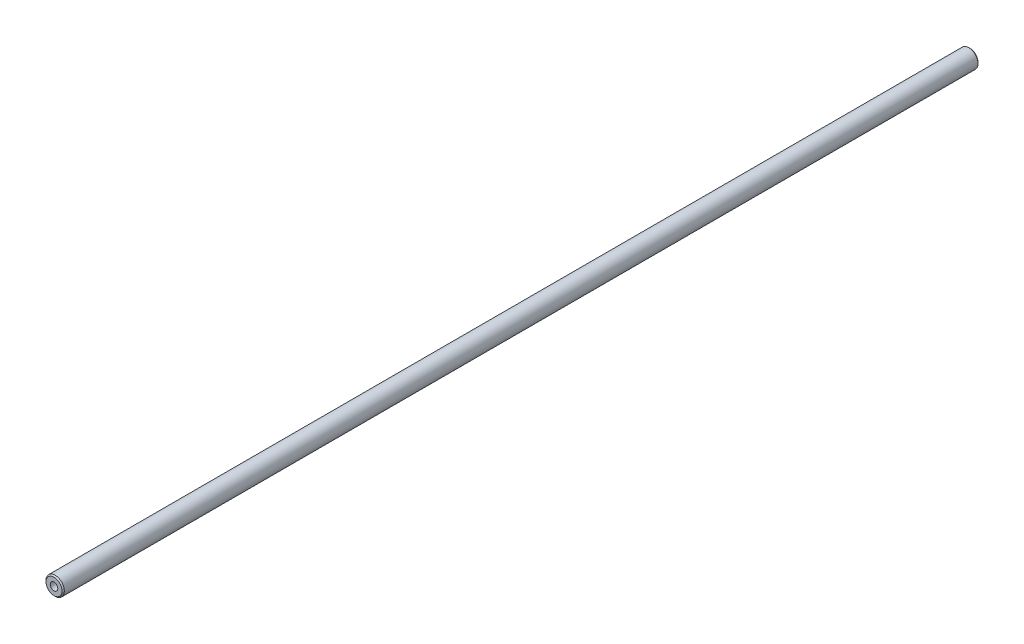
ISO-10303-21;
HEADER;
FILE_DESCRIPTION(('STEP AP214'),'2;1');
FILE_NAME('part.step','',(''),(''),'','','');
FILE_SCHEMA(('AUTOMOTIVE_DESIGN { 1 0 10303 214 1 1 1 1 }'));
ENDSEC;
DATA;
#1=APPLICATION_CONTEXT('core data for automotive mechanical design processes');
#2=APPLICATION_PROTOCOL_DEFINITION('international standard','automotive_design',2000,#1);
#3=PRODUCT_CONTEXT('',#1,'mechanical');
#4=PRODUCT('Part','Part','',(#3));
#5=PRODUCT_RELATED_PRODUCT_CATEGORY('part','',(#4));
#6=PRODUCT_DEFINITION_FORMATION('','',#4);
#7=PRODUCT_DEFINITION_CONTEXT('part definition',#1,'design');
#8=PRODUCT_DEFINITION('design','',#6,#7);
#9=PRODUCT_DEFINITION_SHAPE('','',#8);
#10=(LENGTH_UNIT() NAMED_UNIT(*) SI_UNIT(.MILLI.,.METRE.));
#11=(NAMED_UNIT(*) PLANE_ANGLE_UNIT() SI_UNIT($,.RADIAN.));
#12=(NAMED_UNIT(*) SI_UNIT($,.STERADIAN.) SOLID_ANGLE_UNIT());
#13=UNCERTAINTY_MEASURE_WITH_UNIT(LENGTH_MEASURE(1.E-05),#10,'distance_accuracy_value','');
#14=(GEOMETRIC_REPRESENTATION_CONTEXT(3) GLOBAL_UNCERTAINTY_ASSIGNED_CONTEXT((#13)) GLOBAL_UNIT_ASSIGNED_CONTEXT((#10,
#11,#12)) REPRESENTATION_CONTEXT('',''));
#15=CARTESIAN_POINT('',(0.,0.,0.));
#16=DIRECTION('',(0.,0.,1.));
#17=DIRECTION('',(1.,0.,0.));
#18=AXIS2_PLACEMENT_3D('',#15,#16,#17);
#19=CARTESIAN_POINT('',(0.,0.,388.499999999908));
#20=DIRECTION('',(0.,0.,1.));
#21=DIRECTION('',(0.,-1.,0.));
#22=AXIS2_PLACEMENT_3D('',#19,#20,#21);
#23=CONICAL_SURFACE('',#22,1.64999999981319,1.02974425851388);
#24=CARTESIAN_POINT('',(-1.98951966012828E-10,0.,387.508579978487));
#25=VERTEX_POINT('',#24);
#26=VERTEX_LOOP('',#25);
#27=FACE_BOUND('',#26,.T.);
#28=CARTESIAN_POINT('',(0.,0.,388.5));
#29=DIRECTION('',(0.,0.,1.));
#30=DIRECTION('',(1.,0.,0.));
#31=AXIS2_PLACEMENT_3D('',#28,#29,#30);
#32=CIRCLE('',#31,1.64999999999999);
#33=CARTESIAN_POINT('',(1.64999999999999,0.,388.5));
#34=VERTEX_POINT('',#33);
#35=EDGE_CURVE('E37',#34,#34,#32,.T.);
#36=ORIENTED_EDGE('',*,*,#35,.T.);
#37=EDGE_LOOP('',(#36));
#38=FACE_BOUND('',#37,.T.);
#39=ADVANCED_FACE('F17',(#27,#38),#23,.F.);
#40=CARTESIAN_POINT('',(0.,0.,11.5000000000123));
#41=DIRECTION('',(0.,0.,-1.));
#42=DIRECTION('',(-1.,0.,0.));
#43=AXIS2_PLACEMENT_3D('',#40,#41,#42);
#44=CONICAL_SURFACE('',#43,1.65000000004056,1.02974425860513);
#45=CARTESIAN_POINT('',(0.,-5.68426539819307E-11,12.4914200214619));
#46=VERTEX_POINT('',#45);
#47=VERTEX_LOOP('',#46);
#48=FACE_BOUND('',#47,.T.);
#49=CARTESIAN_POINT('',(0.,0.,11.5));
#50=DIRECTION('',(0.,0.,-1.));
#51=DIRECTION('',(0.,1.,0.));
#52=AXIS2_PLACEMENT_3D('',#49,#50,#51);
#53=CIRCLE('',#52,1.64999999999999);
#54=CARTESIAN_POINT('',(0.,1.64999999999999,11.5));
#55=VERTEX_POINT('',#54);
#56=EDGE_CURVE('E39',#55,#55,#53,.T.);
#57=ORIENTED_EDGE('',*,*,#56,.T.);
#58=EDGE_LOOP('',(#57));
#59=FACE_BOUND('',#58,.T.);
#60=ADVANCED_FACE('F34',(#48,#59),#44,.F.);
#61=CARTESIAN_POINT('',(0.,0.,400.));
#62=DIRECTION('',(0.,0.,1.));
#63=DIRECTION('',(1.,0.,0.));
#64=AXIS2_PLACEMENT_3D('',#61,#62,#63);
#65=CYLINDRICAL_SURFACE('',#64,1.64999999999999);
#66=CARTESIAN_POINT('',(0.,0.,400.));
#67=DIRECTION('',(0.,0.,1.));
#68=DIRECTION('',(1.,0.,0.));
#69=AXIS2_PLACEMENT_3D('',#66,#67,#68);
#70=CIRCLE('',#69,1.64999999999999);
#71=CARTESIAN_POINT('',(1.64999999999999,0.,400.));
#72=VERTEX_POINT('',#71);
#73=EDGE_CURVE('E20',#72,#72,#70,.F.);
#74=ORIENTED_EDGE('',*,*,#73,.F.);
#75=EDGE_LOOP('',(#74));
#76=FACE_BOUND('',#75,.T.);
#77=ORIENTED_EDGE('',*,*,#35,.F.);
#78=EDGE_LOOP('',(#77));
#79=FACE_BOUND('',#78,.T.);
#80=ADVANCED_FACE('F59',(#76,#79),#65,.F.);
#81=CARTESIAN_POINT('',(0.,0.,0.));
#82=DIRECTION('',(0.,0.,-1.));
#83=DIRECTION('',(0.,1.,0.));
#84=AXIS2_PLACEMENT_3D('',#81,#82,#83);
#85=CYLINDRICAL_SURFACE('',#84,1.64999999999999);
#86=ORIENTED_EDGE('',*,*,#56,.F.);
#87=EDGE_LOOP('',(#86));
#88=FACE_BOUND('',#87,.T.);
#89=CARTESIAN_POINT('',(0.,0.,0.));
#90=DIRECTION('',(0.,0.,-1.));
#91=DIRECTION('',(0.,1.,0.));
#92=AXIS2_PLACEMENT_3D('',#89,#90,#91);
#93=CIRCLE('',#92,1.64999999999999);
#94=CARTESIAN_POINT('',(0.,1.64999999999999,0.));
#95=VERTEX_POINT('',#94);
#96=EDGE_CURVE('E50',#95,#95,#93,.T.);
#97=ORIENTED_EDGE('',*,*,#96,.T.);
#98=EDGE_LOOP('',(#97));
#99=FACE_BOUND('',#98,.T.);
#100=ADVANCED_FACE('F61',(#88,#99),#85,.F.);
#101=CARTESIAN_POINT('',(0.,0.,400.));
#102=DIRECTION('',(0.,0.,1.));
#103=DIRECTION('',(1.,0.,0.));
#104=AXIS2_PLACEMENT_3D('',#101,#102,#103);
#105=PLANE('',#104);
#106=CARTESIAN_POINT('',(0.,0.,399.99999999992));
#107=DIRECTION('',(0.,0.,-1.));
#108=DIRECTION('',(-1.,0.,0.));
#109=AXIS2_PLACEMENT_3D('',#106,#107,#108);
#110=CIRCLE('',#109,3.49999999997408);
#111=CARTESIAN_POINT('',(-3.49999999997408,0.,399.99999999992));
#112=VERTEX_POINT('',#111);
#113=EDGE_CURVE('E48',#112,#112,#110,.T.);
#114=ORIENTED_EDGE('',*,*,#113,.F.);
#115=EDGE_LOOP('',(#114));
#116=FACE_BOUND('',#115,.T.);
#117=ORIENTED_EDGE('',*,*,#73,.T.);
#118=EDGE_LOOP('',(#117));
#119=FACE_BOUND('',#118,.T.);
#120=ADVANCED_FACE('F57',(#116,#119),#105,.T.);
#121=CARTESIAN_POINT('',(0.,0.,0.));
#122=DIRECTION('',(0.,0.,1.));
#123=DIRECTION('',(1.,0.,0.));
#124=AXIS2_PLACEMENT_3D('',#121,#122,#123);
#125=PLANE('',#124);
#126=CARTESIAN_POINT('',(0.,0.,0.));
#127=DIRECTION('',(0.,0.,1.));
#128=DIRECTION('',(1.,0.,0.));
#129=AXIS2_PLACEMENT_3D('',#126,#127,#128);
#130=CIRCLE('',#129,3.49999999997408);
#131=CARTESIAN_POINT('',(3.49999999997408,0.,0.));
#132=VERTEX_POINT('',#131);
#133=EDGE_CURVE('E45',#132,#132,#130,.T.);
#134=ORIENTED_EDGE('',*,*,#133,.F.);
#135=EDGE_LOOP('',(#134));
#136=FACE_BOUND('',#135,.T.);
#137=ORIENTED_EDGE('',*,*,#96,.F.);
#138=EDGE_LOOP('',(#137));
#139=FACE_BOUND('',#138,.T.);
#140=ADVANCED_FACE('F85',(#136,#139),#125,.F.);
#141=CARTESIAN_POINT('',(0.,0.,399.499999999989));
#142=DIRECTION('',(0.,0.,-1.));
#143=DIRECTION('',(-1.,0.,0.));
#144=AXIS2_PLACEMENT_3D('',#141,#142,#143);
#145=CONICAL_SURFACE('',#144,3.99999999990541,0.785398163397448);
#146=CARTESIAN_POINT('',(0.,0.,399.5));
#147=DIRECTION('',(0.,0.,-1.));
#148=DIRECTION('',(-1.,0.,0.));
#149=AXIS2_PLACEMENT_3D('',#146,#147,#148);
#150=CIRCLE('',#149,4.);
#151=CARTESIAN_POINT('',(-4.,0.,399.5));
#152=VERTEX_POINT('',#151);
#153=EDGE_CURVE('E26',#152,#152,#150,.T.);
#154=ORIENTED_EDGE('',*,*,#153,.F.);
#155=EDGE_LOOP('',(#154));
#156=FACE_BOUND('',#155,.T.);
#157=ORIENTED_EDGE('',*,*,#113,.T.);
#158=EDGE_LOOP('',(#157));
#159=FACE_BOUND('',#158,.T.);
#160=ADVANCED_FACE('F78',(#156,#159),#145,.T.);
#161=CARTESIAN_POINT('',(0.,0.,0.50000000004502));
#162=DIRECTION('',(0.,0.,1.));
#163=DIRECTION('',(1.,0.,0.));
#164=AXIS2_PLACEMENT_3D('',#161,#162,#163);
#165=CONICAL_SURFACE('',#164,4.0000000000191,0.785398163397448);
#166=CARTESIAN_POINT('',(0.,0.,0.5));
#167=DIRECTION('',(0.,0.,-1.));
#168=DIRECTION('',(-1.,0.,0.));
#169=AXIS2_PLACEMENT_3D('',#166,#167,#168);
#170=CIRCLE('',#169,4.);
#171=CARTESIAN_POINT('',(-4.,0.,0.5));
#172=VERTEX_POINT('',#171);
#173=EDGE_CURVE('E10',#172,#172,#170,.F.);
#174=ORIENTED_EDGE('',*,*,#173,.F.);
#175=EDGE_LOOP('',(#174));
#176=FACE_BOUND('',#175,.T.);
#177=ORIENTED_EDGE('',*,*,#133,.T.);
#178=EDGE_LOOP('',(#177));
#179=FACE_BOUND('',#178,.T.);
#180=ADVANCED_FACE('F72',(#176,#179),#165,.T.);
#181=CARTESIAN_POINT('',(0.,0.,400.));
#182=DIRECTION('',(0.,0.,-1.));
#183=DIRECTION('',(-1.,0.,0.));
#184=AXIS2_PLACEMENT_3D('',#181,#182,#183);
#185=CYLINDRICAL_SURFACE('',#184,4.);
#186=ORIENTED_EDGE('',*,*,#173,.T.);
#187=EDGE_LOOP('',(#186));
#188=FACE_BOUND('',#187,.T.);
#189=ORIENTED_EDGE('',*,*,#153,.T.);
#190=EDGE_LOOP('',(#189));
#191=FACE_BOUND('',#190,.T.);
#192=ADVANCED_FACE('F70',(#188,#191),#185,.T.);
#193=CLOSED_SHELL('',(#39,#60,#80,#100,#120,#140,#160,#180,#192));
#194=MANIFOLD_SOLID_BREP('B1',#193);
#195=ADVANCED_BREP_SHAPE_REPRESENTATION('',(#18,#194),#14);
#196=SHAPE_DEFINITION_REPRESENTATION(#9,#195);
ENDSEC;
END-ISO-10303-21;
